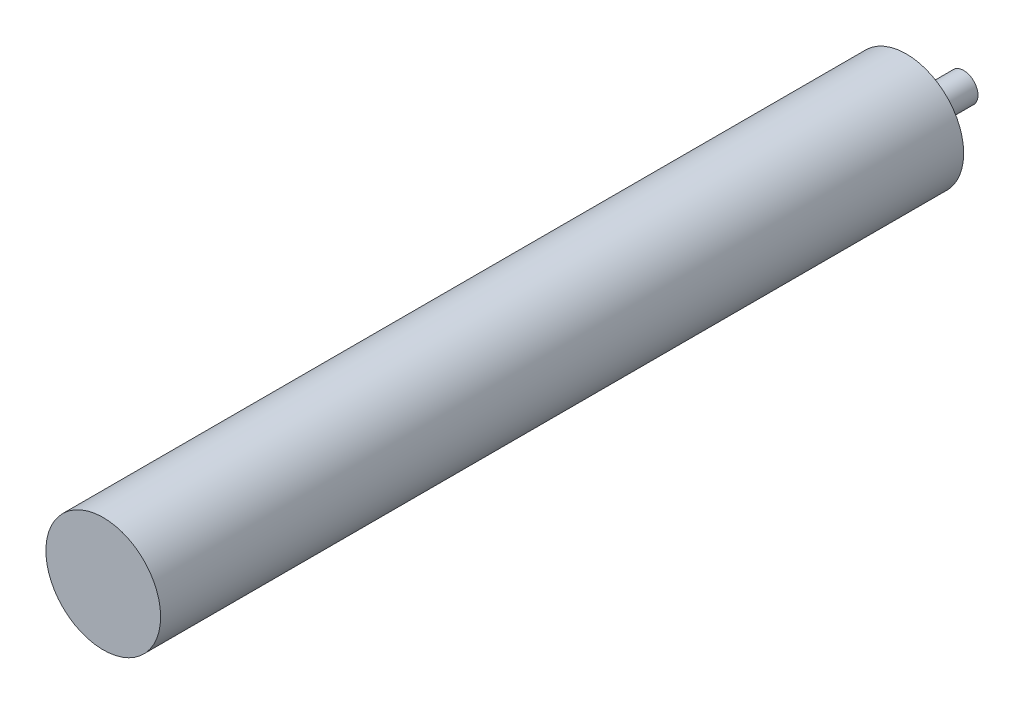
ISO-10303-21;
HEADER;
FILE_DESCRIPTION(('STEP AP214'),'2;1');
FILE_NAME('part.step','',(''),(''),'','','');
FILE_SCHEMA(('AUTOMOTIVE_DESIGN { 1 0 10303 214 1 1 1 1 }'));
ENDSEC;
DATA;
#1=APPLICATION_CONTEXT('core data for automotive mechanical design processes');
#2=APPLICATION_PROTOCOL_DEFINITION('international standard','automotive_design',2000,#1);
#3=PRODUCT_CONTEXT('',#1,'mechanical');
#4=PRODUCT('Part','Part','',(#3));
#5=PRODUCT_RELATED_PRODUCT_CATEGORY('part','',(#4));
#6=PRODUCT_DEFINITION_FORMATION('','',#4);
#7=PRODUCT_DEFINITION_CONTEXT('part definition',#1,'design');
#8=PRODUCT_DEFINITION('design','',#6,#7);
#9=PRODUCT_DEFINITION_SHAPE('','',#8);
#10=(LENGTH_UNIT() NAMED_UNIT(*) SI_UNIT(.MILLI.,.METRE.));
#11=(NAMED_UNIT(*) PLANE_ANGLE_UNIT() SI_UNIT($,.RADIAN.));
#12=(NAMED_UNIT(*) SI_UNIT($,.STERADIAN.) SOLID_ANGLE_UNIT());
#13=UNCERTAINTY_MEASURE_WITH_UNIT(LENGTH_MEASURE(1.E-05),#10,'distance_accuracy_value','');
#14=(GEOMETRIC_REPRESENTATION_CONTEXT(3) GLOBAL_UNCERTAINTY_ASSIGNED_CONTEXT((#13)) GLOBAL_UNIT_ASSIGNED_CONTEXT((#10,
#11,#12)) REPRESENTATION_CONTEXT('',''));
#15=CARTESIAN_POINT('',(0.,0.,0.));
#16=DIRECTION('',(0.,0.,1.));
#17=DIRECTION('',(1.,0.,0.));
#18=AXIS2_PLACEMENT_3D('',#15,#16,#17);
#19=CARTESIAN_POINT('',(0.,0.,2.));
#20=DIRECTION('',(0.,0.,-1.));
#21=DIRECTION('',(-1.,0.,0.));
#22=AXIS2_PLACEMENT_3D('',#19,#20,#21);
#23=CYLINDRICAL_SURFACE('',#22,0.5);
#24=CARTESIAN_POINT('',(0.,0.,2.));
#25=DIRECTION('',(0.,0.,1.));
#26=DIRECTION('',(1.,0.,0.));
#27=AXIS2_PLACEMENT_3D('',#24,#25,#26);
#28=CIRCLE('',#27,0.5);
#29=CARTESIAN_POINT('',(0.5,0.,2.));
#30=VERTEX_POINT('',#29);
#31=EDGE_CURVE('E10',#30,#30,#28,.T.);
#32=ORIENTED_EDGE('',*,*,#31,.F.);
#33=EDGE_LOOP('',(#32));
#34=FACE_BOUND('',#33,.T.);
#35=CARTESIAN_POINT('',(0.,0.,0.));
#36=DIRECTION('',(0.,0.,1.));
#37=DIRECTION('',(1.,0.,0.));
#38=AXIS2_PLACEMENT_3D('',#35,#36,#37);
#39=CIRCLE('',#38,0.5);
#40=CARTESIAN_POINT('',(0.5,0.,0.));
#41=VERTEX_POINT('',#40);
#42=EDGE_CURVE('E46',#41,#41,#39,.T.);
#43=ORIENTED_EDGE('',*,*,#42,.T.);
#44=EDGE_LOOP('',(#43));
#45=FACE_BOUND('',#44,.T.);
#46=ADVANCED_FACE('F43',(#34,#45),#23,.T.);
#47=CARTESIAN_POINT('',(0.,0.,0.));
#48=DIRECTION('',(0.,0.,1.));
#49=DIRECTION('',(1.,0.,0.));
#50=AXIS2_PLACEMENT_3D('',#47,#48,#49);
#51=PLANE('',#50);
#52=ORIENTED_EDGE('',*,*,#42,.F.);
#53=EDGE_LOOP('',(#52));
#54=FACE_BOUND('',#53,.T.);
#55=ADVANCED_FACE('F70',(#54),#51,.F.);
#56=CARTESIAN_POINT('',(0.,0.,30.));
#57=DIRECTION('',(0.,0.,-1.));
#58=DIRECTION('',(-1.,0.,0.));
#59=AXIS2_PLACEMENT_3D('',#56,#57,#58);
#60=CYLINDRICAL_SURFACE('',#59,2.);
#61=CARTESIAN_POINT('',(0.,0.,30.));
#62=DIRECTION('',(0.,0.,1.));
#63=DIRECTION('',(1.,0.,0.));
#64=AXIS2_PLACEMENT_3D('',#61,#62,#63);
#65=CIRCLE('',#64,2.);
#66=CARTESIAN_POINT('',(2.,0.,30.));
#67=VERTEX_POINT('',#66);
#68=EDGE_CURVE('E55',#67,#67,#65,.T.);
#69=ORIENTED_EDGE('',*,*,#68,.F.);
#70=EDGE_LOOP('',(#69));
#71=FACE_BOUND('',#70,.T.);
#72=CARTESIAN_POINT('',(0.,0.,2.));
#73=DIRECTION('',(0.,0.,1.));
#74=DIRECTION('',(1.,0.,0.));
#75=AXIS2_PLACEMENT_3D('',#72,#73,#74);
#76=CIRCLE('',#75,2.);
#77=CARTESIAN_POINT('',(2.,0.,2.));
#78=VERTEX_POINT('',#77);
#79=EDGE_CURVE('E57',#78,#78,#76,.T.);
#80=ORIENTED_EDGE('',*,*,#79,.T.);
#81=EDGE_LOOP('',(#80));
#82=FACE_BOUND('',#81,.T.);
#83=ADVANCED_FACE('F67',(#71,#82),#60,.T.);
#84=CARTESIAN_POINT('',(0.,0.,30.));
#85=DIRECTION('',(0.,0.,1.));
#86=DIRECTION('',(1.,0.,0.));
#87=AXIS2_PLACEMENT_3D('',#84,#85,#86);
#88=PLANE('',#87);
#89=ORIENTED_EDGE('',*,*,#68,.T.);
#90=EDGE_LOOP('',(#89));
#91=FACE_BOUND('',#90,.T.);
#92=ADVANCED_FACE('F65',(#91),#88,.T.);
#93=CARTESIAN_POINT('',(0.,0.,2.));
#94=DIRECTION('',(0.,0.,1.));
#95=DIRECTION('',(1.,0.,0.));
#96=AXIS2_PLACEMENT_3D('',#93,#94,#95);
#97=PLANE('',#96);
#98=ORIENTED_EDGE('',*,*,#31,.T.);
#99=EDGE_LOOP('',(#98));
#100=FACE_BOUND('',#99,.T.);
#101=ORIENTED_EDGE('',*,*,#79,.F.);
#102=EDGE_LOOP('',(#101));
#103=FACE_BOUND('',#102,.T.);
#104=ADVANCED_FACE('F74',(#100,#103),#97,.F.);
#105=CLOSED_SHELL('',(#46,#55,#83,#92,#104));
#106=MANIFOLD_SOLID_BREP('B2',#105);
#107=ADVANCED_BREP_SHAPE_REPRESENTATION('',(#18,#106),#14);
#108=SHAPE_DEFINITION_REPRESENTATION(#9,#107);
ENDSEC;
END-ISO-10303-21;
